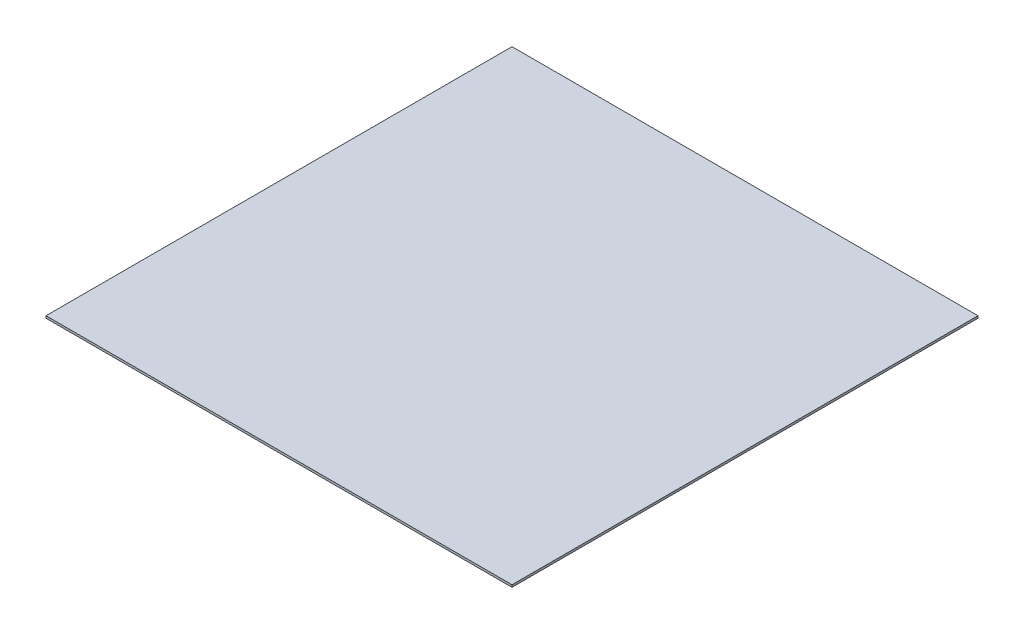
ISO-10303-21;
HEADER;
FILE_DESCRIPTION(('STEP AP214'),'2;1');
FILE_NAME('part.step','',(''),(''),'','','');
FILE_SCHEMA(('AUTOMOTIVE_DESIGN { 1 0 10303 214 1 1 1 1 }'));
ENDSEC;
DATA;
#1=APPLICATION_CONTEXT('core data for automotive mechanical design processes');
#2=APPLICATION_PROTOCOL_DEFINITION('international standard','automotive_design',2000,#1);
#3=PRODUCT_CONTEXT('',#1,'mechanical');
#4=PRODUCT('Part','Part','',(#3));
#5=PRODUCT_RELATED_PRODUCT_CATEGORY('part','',(#4));
#6=PRODUCT_DEFINITION_FORMATION('','',#4);
#7=PRODUCT_DEFINITION_CONTEXT('part definition',#1,'design');
#8=PRODUCT_DEFINITION('design','',#6,#7);
#9=PRODUCT_DEFINITION_SHAPE('','',#8);
#10=(LENGTH_UNIT() NAMED_UNIT(*) SI_UNIT(.MILLI.,.METRE.));
#11=(NAMED_UNIT(*) PLANE_ANGLE_UNIT() SI_UNIT($,.RADIAN.));
#12=(NAMED_UNIT(*) SI_UNIT($,.STERADIAN.) SOLID_ANGLE_UNIT());
#13=UNCERTAINTY_MEASURE_WITH_UNIT(LENGTH_MEASURE(1.E-05),#10,'distance_accuracy_value','');
#14=(GEOMETRIC_REPRESENTATION_CONTEXT(3) GLOBAL_UNCERTAINTY_ASSIGNED_CONTEXT((#13)) GLOBAL_UNIT_ASSIGNED_CONTEXT((#10,
#11,#12)) REPRESENTATION_CONTEXT('',''));
#15=CARTESIAN_POINT('',(0.,0.,0.));
#16=DIRECTION('',(0.,0.,1.));
#17=DIRECTION('',(1.,0.,0.));
#18=AXIS2_PLACEMENT_3D('',#15,#16,#17);
#19=CARTESIAN_POINT('',(0.,9.525,0.));
#20=DIRECTION('',(1.,0.,0.));
#21=DIRECTION('',(0.,0.,-1.));
#22=AXIS2_PLACEMENT_3D('',#19,#20,#21);
#23=PLANE('',#22);
#24=DIRECTION('',(0.,0.,1.));
#25=VECTOR('',#24,1.);
#26=CARTESIAN_POINT('',(0.,0.,0.));
#27=LINE('',#26,#25);
#28=CARTESIAN_POINT('',(0.,0.,0.));
#29=VERTEX_POINT('',#28);
#30=CARTESIAN_POINT('',(0.,0.,2000.));
#31=VERTEX_POINT('',#30);
#32=EDGE_CURVE('E100',#29,#31,#27,.T.);
#33=ORIENTED_EDGE('',*,*,#32,.T.);
#34=DIRECTION('',(0.,-1.,0.));
#35=VECTOR('',#34,1.);
#36=CARTESIAN_POINT('',(0.,9.525,2000.));
#37=LINE('',#36,#35);
#38=CARTESIAN_POINT('',(0.,9.525,2000.));
#39=VERTEX_POINT('',#38);
#40=EDGE_CURVE('E11',#39,#31,#37,.T.);
#41=ORIENTED_EDGE('',*,*,#40,.F.);
#42=DIRECTION('',(0.,0.,1.));
#43=VECTOR('',#42,1.);
#44=CARTESIAN_POINT('',(0.,9.525,0.));
#45=LINE('',#44,#43);
#46=CARTESIAN_POINT('',(0.,9.525,0.));
#47=VERTEX_POINT('',#46);
#48=EDGE_CURVE('E88',#47,#39,#45,.T.);
#49=ORIENTED_EDGE('',*,*,#48,.F.);
#50=DIRECTION('',(0.,-1.,0.));
#51=VECTOR('',#50,1.);
#52=CARTESIAN_POINT('',(0.,9.525,0.));
#53=LINE('',#52,#51);
#54=EDGE_CURVE('E96',#47,#29,#53,.T.);
#55=ORIENTED_EDGE('',*,*,#54,.T.);
#56=EDGE_LOOP('',(#33,#41,#49,#55));
#57=FACE_BOUND('',#56,.T.);
#58=ADVANCED_FACE('F37',(#57),#23,.F.);
#59=CARTESIAN_POINT('',(0.,9.525,2000.));
#60=DIRECTION('',(0.,0.,-1.));
#61=DIRECTION('',(-1.,0.,0.));
#62=AXIS2_PLACEMENT_3D('',#59,#60,#61);
#63=PLANE('',#62);
#64=DIRECTION('',(1.,0.,0.));
#65=VECTOR('',#64,1.);
#66=CARTESIAN_POINT('',(0.,0.,2000.));
#67=LINE('',#66,#65);
#68=CARTESIAN_POINT('',(2000.,0.,2000.));
#69=VERTEX_POINT('',#68);
#70=EDGE_CURVE('E92',#31,#69,#67,.T.);
#71=ORIENTED_EDGE('',*,*,#70,.T.);
#72=DIRECTION('',(0.,-1.,0.));
#73=VECTOR('',#72,1.);
#74=CARTESIAN_POINT('',(2000.,9.525,2000.));
#75=LINE('',#74,#73);
#76=CARTESIAN_POINT('',(2000.,9.525,2000.));
#77=VERTEX_POINT('',#76);
#78=EDGE_CURVE('E45',#77,#69,#75,.T.);
#79=ORIENTED_EDGE('',*,*,#78,.F.);
#80=DIRECTION('',(1.,0.,0.));
#81=VECTOR('',#80,1.);
#82=CARTESIAN_POINT('',(0.,9.525,2000.));
#83=LINE('',#82,#81);
#84=EDGE_CURVE('E83',#39,#77,#83,.T.);
#85=ORIENTED_EDGE('',*,*,#84,.F.);
#86=ORIENTED_EDGE('',*,*,#40,.T.);
#87=EDGE_LOOP('',(#71,#79,#85,#86));
#88=FACE_BOUND('',#87,.T.);
#89=ADVANCED_FACE('F91',(#88),#63,.F.);
#90=CARTESIAN_POINT('',(2000.,9.525,0.));
#91=DIRECTION('',(-1.,0.,0.));
#92=DIRECTION('',(0.,0.,1.));
#93=AXIS2_PLACEMENT_3D('',#90,#91,#92);
#94=PLANE('',#93);
#95=DIRECTION('',(0.,0.,-1.));
#96=VECTOR('',#95,1.);
#97=CARTESIAN_POINT('',(2000.,0.,0.));
#98=LINE('',#97,#96);
#99=CARTESIAN_POINT('',(2000.,0.,0.));
#100=VERTEX_POINT('',#99);
#101=EDGE_CURVE('E70',#69,#100,#98,.T.);
#102=ORIENTED_EDGE('',*,*,#101,.T.);
#103=DIRECTION('',(0.,-1.,0.));
#104=VECTOR('',#103,1.);
#105=CARTESIAN_POINT('',(2000.,9.525,0.));
#106=LINE('',#105,#104);
#107=CARTESIAN_POINT('',(2000.,9.525,0.));
#108=VERTEX_POINT('',#107);
#109=EDGE_CURVE('E93',#108,#100,#106,.T.);
#110=ORIENTED_EDGE('',*,*,#109,.F.);
#111=DIRECTION('',(0.,0.,-1.));
#112=VECTOR('',#111,1.);
#113=CARTESIAN_POINT('',(2000.,9.525,0.));
#114=LINE('',#113,#112);
#115=EDGE_CURVE('E86',#77,#108,#114,.T.);
#116=ORIENTED_EDGE('',*,*,#115,.F.);
#117=ORIENTED_EDGE('',*,*,#78,.T.);
#118=EDGE_LOOP('',(#102,#110,#116,#117));
#119=FACE_BOUND('',#118,.T.);
#120=ADVANCED_FACE('F94',(#119),#94,.F.);
#121=CARTESIAN_POINT('',(0.,9.525,0.));
#122=DIRECTION('',(0.,0.,1.));
#123=DIRECTION('',(1.,0.,0.));
#124=AXIS2_PLACEMENT_3D('',#121,#122,#123);
#125=PLANE('',#124);
#126=DIRECTION('',(-1.,0.,0.));
#127=VECTOR('',#126,1.);
#128=CARTESIAN_POINT('',(0.,0.,0.));
#129=LINE('',#128,#127);
#130=EDGE_CURVE('E76',#100,#29,#129,.T.);
#131=ORIENTED_EDGE('',*,*,#130,.T.);
#132=ORIENTED_EDGE('',*,*,#54,.F.);
#133=DIRECTION('',(-1.,0.,0.));
#134=VECTOR('',#133,1.);
#135=CARTESIAN_POINT('',(0.,9.525,0.));
#136=LINE('',#135,#134);
#137=EDGE_CURVE('E53',#108,#47,#136,.T.);
#138=ORIENTED_EDGE('',*,*,#137,.F.);
#139=ORIENTED_EDGE('',*,*,#109,.T.);
#140=EDGE_LOOP('',(#131,#132,#138,#139));
#141=FACE_BOUND('',#140,.T.);
#142=ADVANCED_FACE('F107',(#141),#125,.F.);
#143=CARTESIAN_POINT('',(0.,9.525,0.));
#144=DIRECTION('',(0.,1.,0.));
#145=DIRECTION('',(0.,0.,1.));
#146=AXIS2_PLACEMENT_3D('',#143,#144,#145);
#147=PLANE('',#146);
#148=ORIENTED_EDGE('',*,*,#48,.T.);
#149=ORIENTED_EDGE('',*,*,#84,.T.);
#150=ORIENTED_EDGE('',*,*,#115,.T.);
#151=ORIENTED_EDGE('',*,*,#137,.T.);
#152=EDGE_LOOP('',(#148,#149,#150,#151));
#153=FACE_BOUND('',#152,.T.);
#154=ADVANCED_FACE('F84',(#153),#147,.T.);
#155=CARTESIAN_POINT('',(0.,0.,0.));
#156=DIRECTION('',(0.,1.,0.));
#157=DIRECTION('',(0.,0.,1.));
#158=AXIS2_PLACEMENT_3D('',#155,#156,#157);
#159=PLANE('',#158);
#160=ORIENTED_EDGE('',*,*,#32,.F.);
#161=ORIENTED_EDGE('',*,*,#130,.F.);
#162=ORIENTED_EDGE('',*,*,#101,.F.);
#163=ORIENTED_EDGE('',*,*,#70,.F.);
#164=EDGE_LOOP('',(#160,#161,#162,#163));
#165=FACE_BOUND('',#164,.T.);
#166=ADVANCED_FACE('F110',(#165),#159,.F.);
#167=CLOSED_SHELL('',(#58,#89,#120,#142,#154,#166));
#168=MANIFOLD_SOLID_BREP('B2',#167);
#169=ADVANCED_BREP_SHAPE_REPRESENTATION('',(#18,#168),#14);
#170=SHAPE_DEFINITION_REPRESENTATION(#9,#169);
ENDSEC;
END-ISO-10303-21;
